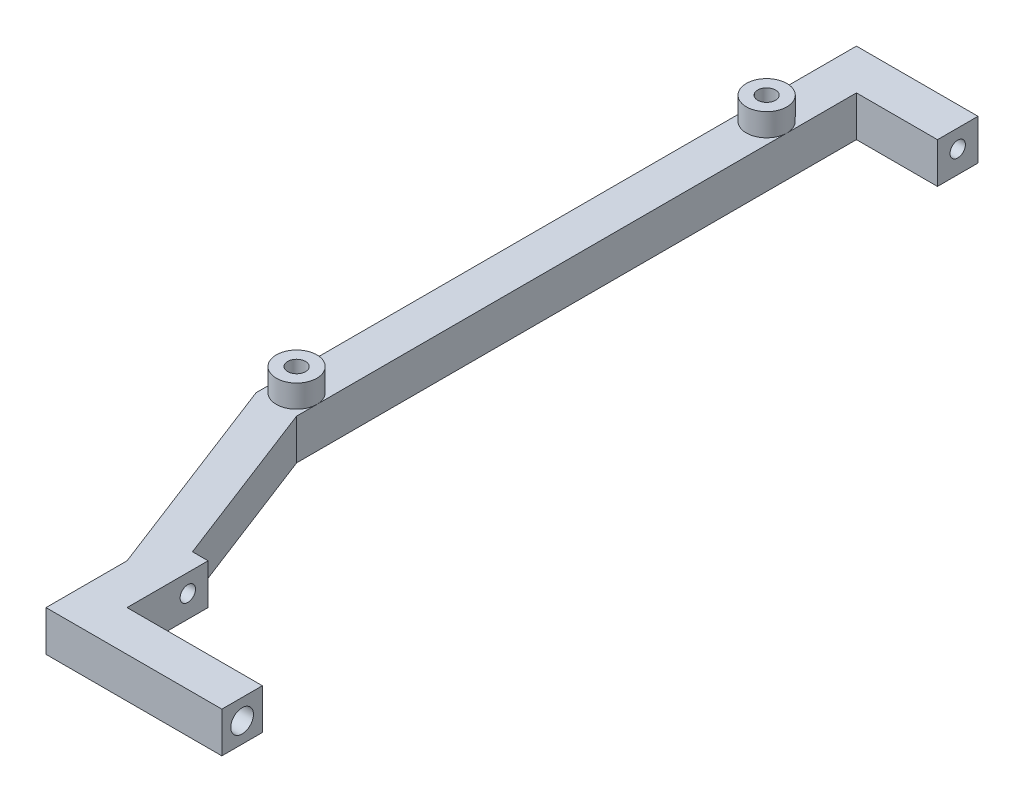
ISO-10303-21;
HEADER;
FILE_DESCRIPTION(('STEP AP214'),'2;1');
FILE_NAME('part.step','',(''),(''),'','','');
FILE_SCHEMA(('AUTOMOTIVE_DESIGN { 1 0 10303 214 1 1 1 1 }'));
ENDSEC;
DATA;
#1=APPLICATION_CONTEXT('core data for automotive mechanical design processes');
#2=APPLICATION_PROTOCOL_DEFINITION('international standard','automotive_design',2000,#1);
#3=PRODUCT_CONTEXT('',#1,'mechanical');
#4=PRODUCT('Part','Part','',(#3));
#5=PRODUCT_RELATED_PRODUCT_CATEGORY('part','',(#4));
#6=PRODUCT_DEFINITION_FORMATION('','',#4);
#7=PRODUCT_DEFINITION_CONTEXT('part definition',#1,'design');
#8=PRODUCT_DEFINITION('design','',#6,#7);
#9=PRODUCT_DEFINITION_SHAPE('','',#8);
#10=(LENGTH_UNIT() NAMED_UNIT(*) SI_UNIT(.MILLI.,.METRE.));
#11=(NAMED_UNIT(*) PLANE_ANGLE_UNIT() SI_UNIT($,.RADIAN.));
#12=(NAMED_UNIT(*) SI_UNIT($,.STERADIAN.) SOLID_ANGLE_UNIT());
#13=UNCERTAINTY_MEASURE_WITH_UNIT(LENGTH_MEASURE(1.E-05),#10,'distance_accuracy_value','');
#14=(GEOMETRIC_REPRESENTATION_CONTEXT(3) GLOBAL_UNCERTAINTY_ASSIGNED_CONTEXT((#13)) GLOBAL_UNIT_ASSIGNED_CONTEXT((#10,
#11,#12)) REPRESENTATION_CONTEXT('',''));
#15=CARTESIAN_POINT('',(0.,0.,0.));
#16=DIRECTION('',(0.,0.,1.));
#17=DIRECTION('',(1.,0.,0.));
#18=AXIS2_PLACEMENT_3D('',#15,#16,#17);
#19=CARTESIAN_POINT('',(-2.5,2.5,74.08));
#20=DIRECTION('',(0.,-1.,0.));
#21=DIRECTION('',(0.,0.,-1.));
#22=AXIS2_PLACEMENT_3D('',#19,#20,#21);
#23=PLANE('',#22);
#24=CARTESIAN_POINT('',(4.02455846426619E-13,2.5,71.58));
#25=DIRECTION('',(0.,1.,0.));
#26=DIRECTION('',(0.,0.,1.));
#27=AXIS2_PLACEMENT_3D('',#24,#25,#26);
#28=CIRCLE('',#27,2.5);
#29=CARTESIAN_POINT('',(-2.5,2.5,71.58));
#30=VERTEX_POINT('',#29);
#31=CARTESIAN_POINT('',(2.5,2.5,71.58));
#32=VERTEX_POINT('',#31);
#33=EDGE_CURVE('E264',#30,#32,#28,.T.);
#34=ORIENTED_EDGE('',*,*,#33,.F.);
#35=DIRECTION('',(0.,0.,-1.));
#36=VECTOR('',#35,1.);
#37=CARTESIAN_POINT('',(-2.5,2.5,74.08));
#38=LINE('',#37,#36);
#39=CARTESIAN_POINT('',(-2.5,2.5,74.08));
#40=VERTEX_POINT('',#39);
#41=EDGE_CURVE('E348',#40,#30,#38,.T.);
#42=ORIENTED_EDGE('',*,*,#41,.F.);
#43=DIRECTION('',(0.359943685024825,0.,0.932974031584347));
#44=VECTOR('',#43,1.);
#45=CARTESIAN_POINT('',(-2.5,2.5,74.08));
#46=LINE('',#45,#44);
#47=CARTESIAN_POINT('',(7.5,2.5,100.));
#48=VERTEX_POINT('',#47);
#49=EDGE_CURVE('E177',#40,#48,#46,.T.);
#50=ORIENTED_EDGE('',*,*,#49,.T.);
#51=DIRECTION('',(0.,0.,1.));
#52=VECTOR('',#51,1.);
#53=CARTESIAN_POINT('',(7.5,2.5,74.08));
#54=LINE('',#53,#52);
#55=CARTESIAN_POINT('',(7.5,2.5,110.));
#56=VERTEX_POINT('',#55);
#57=EDGE_CURVE('E156',#48,#56,#54,.T.);
#58=ORIENTED_EDGE('',*,*,#57,.T.);
#59=DIRECTION('',(1.,0.,0.));
#60=VECTOR('',#59,1.);
#61=CARTESIAN_POINT('',(-2.5,2.5,110.));
#62=LINE('',#61,#60);
#63=CARTESIAN_POINT('',(29.2,2.5,110.));
#64=VERTEX_POINT('',#63);
#65=EDGE_CURVE('E166',#56,#64,#62,.T.);
#66=ORIENTED_EDGE('',*,*,#65,.T.);
#67=DIRECTION('',(0.,0.,-1.));
#68=VECTOR('',#67,1.);
#69=CARTESIAN_POINT('',(29.2,2.5,74.08));
#70=LINE('',#69,#68);
#71=CARTESIAN_POINT('',(29.2,2.5,105.));
#72=VERTEX_POINT('',#71);
#73=EDGE_CURVE('E173',#64,#72,#70,.T.);
#74=ORIENTED_EDGE('',*,*,#73,.T.);
#75=DIRECTION('',(-1.,0.,0.));
#76=VECTOR('',#75,1.);
#77=CARTESIAN_POINT('',(-2.5,2.5,105.));
#78=LINE('',#77,#76);
#79=CARTESIAN_POINT('',(12.5,2.5,105.));
#80=VERTEX_POINT('',#79);
#81=EDGE_CURVE('E163',#72,#80,#78,.T.);
#82=ORIENTED_EDGE('',*,*,#81,.T.);
#83=DIRECTION('',(0.,0.,1.));
#84=VECTOR('',#83,1.);
#85=CARTESIAN_POINT('',(12.5,2.49999999999934,95.));
#86=LINE('',#85,#84);
#87=CARTESIAN_POINT('',(12.5,2.49999999999934,95.));
#88=VERTEX_POINT('',#87);
#89=EDGE_CURVE('E222',#88,#80,#86,.T.);
#90=ORIENTED_EDGE('',*,*,#89,.F.);
#91=DIRECTION('',(1.,0.,0.));
#92=VECTOR('',#91,1.);
#93=CARTESIAN_POINT('',(7.5,2.49999999999934,95.));
#94=LINE('',#93,#92);
#95=CARTESIAN_POINT('',(10.570987654321,2.49999999999934,95.));
#96=VERTEX_POINT('',#95);
#97=EDGE_CURVE('E226',#96,#88,#94,.T.);
#98=ORIENTED_EDGE('',*,*,#97,.F.);
#99=DIRECTION('',(-0.359943685024825,0.,-0.932974031584347));
#100=VECTOR('',#99,1.);
#101=CARTESIAN_POINT('',(1.85220271805375,2.5,72.4009094451953));
#102=LINE('',#101,#100);
#103=CARTESIAN_POINT('',(2.5,2.5,74.08));
#104=VERTEX_POINT('',#103);
#105=EDGE_CURVE('E229',#96,#104,#102,.T.);
#106=ORIENTED_EDGE('',*,*,#105,.T.);
#107=DIRECTION('',(0.,0.,-1.));
#108=VECTOR('',#107,1.);
#109=CARTESIAN_POINT('',(2.5,2.5,74.08));
#110=LINE('',#109,#108);
#111=EDGE_CURVE('E43',#104,#32,#110,.T.);
#112=ORIENTED_EDGE('',*,*,#111,.T.);
#113=EDGE_LOOP('',(#34,#42,#50,#58,#66,#74,#82,#90,#98,#106,#112));
#114=FACE_BOUND('',#113,.T.);
#115=ADVANCED_FACE('F39',(#114),#23,.F.);
#116=CARTESIAN_POINT('',(1.04083408558608E-13,2.5,13.58));
#117=DIRECTION('',(0.,1.,0.));
#118=DIRECTION('',(0.,0.,1.));
#119=AXIS2_PLACEMENT_3D('',#116,#117,#118);
#120=CIRCLE('',#119,2.49999999999999);
#121=CARTESIAN_POINT('',(2.50000000000009,2.5,13.58));
#122=VERTEX_POINT('',#121);
#123=CARTESIAN_POINT('',(-2.5,2.5,13.58));
#124=VERTEX_POINT('',#123);
#125=EDGE_CURVE('E50',#122,#124,#120,.T.);
#126=ORIENTED_EDGE('',*,*,#125,.F.);
#127=CARTESIAN_POINT('',(2.5,2.5,5.));
#128=VERTEX_POINT('',#127);
#129=EDGE_CURVE('E350',#122,#128,#110,.T.);
#130=ORIENTED_EDGE('',*,*,#129,.T.);
#131=DIRECTION('',(-1.,0.,0.));
#132=VECTOR('',#131,1.);
#133=CARTESIAN_POINT('',(12.5,2.5,5.));
#134=LINE('',#133,#132);
#135=CARTESIAN_POINT('',(12.5,2.5,5.));
#136=VERTEX_POINT('',#135);
#137=EDGE_CURVE('E311',#136,#128,#134,.T.);
#138=ORIENTED_EDGE('',*,*,#137,.F.);
#139=DIRECTION('',(0.,0.,1.));
#140=VECTOR('',#139,1.);
#141=CARTESIAN_POINT('',(12.5,2.5,0.));
#142=LINE('',#141,#140);
#143=CARTESIAN_POINT('',(12.5,2.5,0.));
#144=VERTEX_POINT('',#143);
#145=EDGE_CURVE('E294',#144,#136,#142,.T.);
#146=ORIENTED_EDGE('',*,*,#145,.F.);
#147=DIRECTION('',(-1.,0.,0.));
#148=VECTOR('',#147,1.);
#149=CARTESIAN_POINT('',(-2.5,2.5,0.));
#150=LINE('',#149,#148);
#151=CARTESIAN_POINT('',(-2.5,2.5,0.));
#152=VERTEX_POINT('',#151);
#153=EDGE_CURVE('E320',#144,#152,#150,.T.);
#154=ORIENTED_EDGE('',*,*,#153,.T.);
#155=EDGE_CURVE('E347',#124,#152,#38,.T.);
#156=ORIENTED_EDGE('',*,*,#155,.F.);
#157=EDGE_LOOP('',(#126,#130,#138,#146,#154,#156));
#158=FACE_BOUND('',#157,.T.);
#159=ADVANCED_FACE('F362',(#158),#23,.F.);
#160=CARTESIAN_POINT('',(2.5,2.5,74.08));
#161=DIRECTION('',(-1.,0.,0.));
#162=DIRECTION('',(0.,-1.,0.));
#163=AXIS2_PLACEMENT_3D('',#160,#161,#162);
#164=PLANE('',#163);
#165=DIRECTION('',(0.,-1.,0.));
#166=VECTOR('',#165,1.);
#167=CARTESIAN_POINT('',(2.5,2.5,5.));
#168=LINE('',#167,#166);
#169=CARTESIAN_POINT('',(2.5,-2.5,5.));
#170=VERTEX_POINT('',#169);
#171=EDGE_CURVE('E286',#128,#170,#168,.T.);
#172=ORIENTED_EDGE('',*,*,#171,.F.);
#173=ORIENTED_EDGE('',*,*,#129,.F.);
#174=EDGE_CURVE('E354',#32,#122,#110,.T.);
#175=ORIENTED_EDGE('',*,*,#174,.F.);
#176=ORIENTED_EDGE('',*,*,#111,.F.);
#177=DIRECTION('',(0.,1.,0.));
#178=VECTOR('',#177,1.);
#179=CARTESIAN_POINT('',(2.5,2.5,74.08));
#180=LINE('',#179,#178);
#181=CARTESIAN_POINT('',(2.5,-2.5,74.08));
#182=VERTEX_POINT('',#181);
#183=EDGE_CURVE('E324',#182,#104,#180,.T.);
#184=ORIENTED_EDGE('',*,*,#183,.F.);
#185=DIRECTION('',(0.,0.,-1.));
#186=VECTOR('',#185,1.);
#187=CARTESIAN_POINT('',(2.5,-2.5,74.08));
#188=LINE('',#187,#186);
#189=EDGE_CURVE('E333',#182,#170,#188,.T.);
#190=ORIENTED_EDGE('',*,*,#189,.T.);
#191=EDGE_LOOP('',(#172,#173,#175,#176,#184,#190));
#192=FACE_BOUND('',#191,.T.);
#193=ADVANCED_FACE('F41',(#192),#164,.F.);
#194=EDGE_CURVE('E57',#32,#30,#28,.T.);
#195=ORIENTED_EDGE('',*,*,#194,.F.);
#196=ORIENTED_EDGE('',*,*,#174,.T.);
#197=EDGE_CURVE('E11',#124,#122,#120,.T.);
#198=ORIENTED_EDGE('',*,*,#197,.F.);
#199=EDGE_CURVE('E64',#30,#124,#38,.T.);
#200=ORIENTED_EDGE('',*,*,#199,.F.);
#201=EDGE_LOOP('',(#195,#196,#198,#200));
#202=FACE_BOUND('',#201,.T.);
#203=ADVANCED_FACE('F425',(#202),#23,.F.);
#204=CARTESIAN_POINT('',(-2.5,2.5,74.08));
#205=DIRECTION('',(1.,0.,0.));
#206=DIRECTION('',(0.,1.,0.));
#207=AXIS2_PLACEMENT_3D('',#204,#205,#206);
#208=PLANE('',#207);
#209=DIRECTION('',(0.,-1.,0.));
#210=VECTOR('',#209,1.);
#211=CARTESIAN_POINT('',(-2.5,2.5,0.));
#212=LINE('',#211,#210);
#213=CARTESIAN_POINT('',(-2.5,-2.5,0.));
#214=VERTEX_POINT('',#213);
#215=EDGE_CURVE('E337',#152,#214,#212,.T.);
#216=ORIENTED_EDGE('',*,*,#215,.T.);
#217=DIRECTION('',(0.,0.,-1.));
#218=VECTOR('',#217,1.);
#219=CARTESIAN_POINT('',(-2.5,-2.5,74.08));
#220=LINE('',#219,#218);
#221=CARTESIAN_POINT('',(-2.5,-2.5,74.08));
#222=VERTEX_POINT('',#221);
#223=EDGE_CURVE('E344',#222,#214,#220,.T.);
#224=ORIENTED_EDGE('',*,*,#223,.F.);
#225=DIRECTION('',(0.,-1.,0.));
#226=VECTOR('',#225,1.);
#227=CARTESIAN_POINT('',(-2.5,2.5,74.08));
#228=LINE('',#227,#226);
#229=EDGE_CURVE('E328',#40,#222,#228,.T.);
#230=ORIENTED_EDGE('',*,*,#229,.F.);
#231=ORIENTED_EDGE('',*,*,#41,.T.);
#232=ORIENTED_EDGE('',*,*,#199,.T.);
#233=ORIENTED_EDGE('',*,*,#155,.T.);
#234=EDGE_LOOP('',(#216,#224,#230,#231,#232,#233));
#235=FACE_BOUND('',#234,.T.);
#236=ADVANCED_FACE('F357',(#235),#208,.F.);
#237=CARTESIAN_POINT('',(-2.5,-2.5,74.08));
#238=DIRECTION('',(0.,1.,0.));
#239=DIRECTION('',(0.,0.,1.));
#240=AXIS2_PLACEMENT_3D('',#237,#238,#239);
#241=PLANE('',#240);
#242=DIRECTION('',(1.,0.,0.));
#243=VECTOR('',#242,1.);
#244=CARTESIAN_POINT('',(-2.5,-2.5,0.));
#245=LINE('',#244,#243);
#246=CARTESIAN_POINT('',(12.5,-2.5,0.));
#247=VERTEX_POINT('',#246);
#248=EDGE_CURVE('E329',#214,#247,#245,.T.);
#249=ORIENTED_EDGE('',*,*,#248,.T.);
#250=DIRECTION('',(0.,0.,-1.));
#251=VECTOR('',#250,1.);
#252=CARTESIAN_POINT('',(12.5,-2.5,0.));
#253=LINE('',#252,#251);
#254=CARTESIAN_POINT('',(12.5,-2.5,5.));
#255=VERTEX_POINT('',#254);
#256=EDGE_CURVE('E300',#255,#247,#253,.T.);
#257=ORIENTED_EDGE('',*,*,#256,.F.);
#258=DIRECTION('',(-1.,0.,0.));
#259=VECTOR('',#258,1.);
#260=CARTESIAN_POINT('',(12.5,-2.5,5.));
#261=LINE('',#260,#259);
#262=EDGE_CURVE('E304',#255,#170,#261,.T.);
#263=ORIENTED_EDGE('',*,*,#262,.T.);
#264=ORIENTED_EDGE('',*,*,#189,.F.);
#265=DIRECTION('',(-0.359943685024825,0.,-0.932974031584347));
#266=VECTOR('',#265,1.);
#267=CARTESIAN_POINT('',(1.85220271805375,-2.50000000000066,72.4009094451953));
#268=LINE('',#267,#266);
#269=CARTESIAN_POINT('',(10.570987654321,-2.50000000000066,95.));
#270=VERTEX_POINT('',#269);
#271=EDGE_CURVE('E238',#270,#182,#268,.T.);
#272=ORIENTED_EDGE('',*,*,#271,.F.);
#273=DIRECTION('',(1.,0.,0.));
#274=VECTOR('',#273,1.);
#275=CARTESIAN_POINT('',(7.5,-2.50000000000066,95.));
#276=LINE('',#275,#274);
#277=CARTESIAN_POINT('',(12.5,-2.50000000000066,95.));
#278=VERTEX_POINT('',#277);
#279=EDGE_CURVE('E225',#270,#278,#276,.T.);
#280=ORIENTED_EDGE('',*,*,#279,.T.);
#281=DIRECTION('',(0.,0.,-1.));
#282=VECTOR('',#281,1.);
#283=CARTESIAN_POINT('',(12.5,-2.50000000000066,100.));
#284=LINE('',#283,#282);
#285=CARTESIAN_POINT('',(12.5,-2.5,105.));
#286=VERTEX_POINT('',#285);
#287=EDGE_CURVE('E211',#286,#278,#284,.T.);
#288=ORIENTED_EDGE('',*,*,#287,.F.);
#289=DIRECTION('',(1.,0.,0.));
#290=VECTOR('',#289,1.);
#291=CARTESIAN_POINT('',(-2.5,-2.5,105.));
#292=LINE('',#291,#290);
#293=CARTESIAN_POINT('',(29.2,-2.5,105.));
#294=VERTEX_POINT('',#293);
#295=EDGE_CURVE('E186',#286,#294,#292,.T.);
#296=ORIENTED_EDGE('',*,*,#295,.T.);
#297=DIRECTION('',(0.,0.,1.));
#298=VECTOR('',#297,1.);
#299=CARTESIAN_POINT('',(29.2,-2.5,74.08));
#300=LINE('',#299,#298);
#301=CARTESIAN_POINT('',(29.2,-2.5,110.));
#302=VERTEX_POINT('',#301);
#303=EDGE_CURVE('E399',#294,#302,#300,.T.);
#304=ORIENTED_EDGE('',*,*,#303,.T.);
#305=DIRECTION('',(-1.,0.,0.));
#306=VECTOR('',#305,1.);
#307=CARTESIAN_POINT('',(-2.5,-2.5,110.));
#308=LINE('',#307,#306);
#309=CARTESIAN_POINT('',(7.5,-2.5,110.));
#310=VERTEX_POINT('',#309);
#311=EDGE_CURVE('E198',#302,#310,#308,.T.);
#312=ORIENTED_EDGE('',*,*,#311,.T.);
#313=DIRECTION('',(0.,0.,-1.));
#314=VECTOR('',#313,1.);
#315=CARTESIAN_POINT('',(7.5,-2.5,74.08));
#316=LINE('',#315,#314);
#317=CARTESIAN_POINT('',(7.5,-2.50000000000066,100.));
#318=VERTEX_POINT('',#317);
#319=EDGE_CURVE('E158',#310,#318,#316,.T.);
#320=ORIENTED_EDGE('',*,*,#319,.T.);
#321=DIRECTION('',(0.359943685024825,0.,0.932974031584347));
#322=VECTOR('',#321,1.);
#323=CARTESIAN_POINT('',(-2.5,-2.50000000000066,74.08));
#324=LINE('',#323,#322);
#325=EDGE_CURVE('E234',#222,#318,#324,.T.);
#326=ORIENTED_EDGE('',*,*,#325,.F.);
#327=ORIENTED_EDGE('',*,*,#223,.T.);
#328=EDGE_LOOP('',(#249,#257,#263,#264,#272,#280,#288,#296,#304,#312,#320,#326,#327));
#329=FACE_BOUND('',#328,.T.);
#330=ADVANCED_FACE('F370',(#329),#241,.F.);
#331=CARTESIAN_POINT('',(0.,0.,0.));
#332=DIRECTION('',(0.,0.,1.));
#333=DIRECTION('',(1.,0.,0.));
#334=AXIS2_PLACEMENT_3D('',#331,#332,#333);
#335=PLANE('',#334);
#336=CARTESIAN_POINT('',(0.,0.,0.));
#337=DIRECTION('',(0.,0.,-1.));
#338=DIRECTION('',(-1.,0.,0.));
#339=AXIS2_PLACEMENT_3D('',#336,#337,#338);
#340=CIRCLE('',#339,1.4);
#341=CARTESIAN_POINT('',(-1.4,0.,0.));
#342=VERTEX_POINT('',#341);
#343=EDGE_CURVE('E315',#342,#342,#340,.T.);
#344=ORIENTED_EDGE('',*,*,#343,.F.);
#345=EDGE_LOOP('',(#344));
#346=FACE_BOUND('',#345,.T.);
#347=ORIENTED_EDGE('',*,*,#153,.F.);
#348=DIRECTION('',(0.,1.,0.));
#349=VECTOR('',#348,1.);
#350=CARTESIAN_POINT('',(12.5,2.5,0.));
#351=LINE('',#350,#349);
#352=EDGE_CURVE('E290',#247,#144,#351,.T.);
#353=ORIENTED_EDGE('',*,*,#352,.F.);
#354=ORIENTED_EDGE('',*,*,#248,.F.);
#355=ORIENTED_EDGE('',*,*,#215,.F.);
#356=EDGE_LOOP('',(#347,#353,#354,#355));
#357=FACE_BOUND('',#356,.T.);
#358=ADVANCED_FACE('F367',(#346,#357),#335,.F.);
#359=CARTESIAN_POINT('',(0.,0.,10.));
#360=DIRECTION('',(0.,0.,-1.));
#361=DIRECTION('',(-1.,0.,0.));
#362=AXIS2_PLACEMENT_3D('',#359,#360,#361);
#363=CYLINDRICAL_SURFACE('',#362,1.4);
#364=CARTESIAN_POINT('',(0.,0.,10.));
#365=DIRECTION('',(0.,0.,-1.));
#366=DIRECTION('',(-1.,0.,0.));
#367=AXIS2_PLACEMENT_3D('',#364,#365,#366);
#368=CIRCLE('',#367,1.4);
#369=CARTESIAN_POINT('',(-1.4,0.,10.));
#370=VERTEX_POINT('',#369);
#371=EDGE_CURVE('E316',#370,#370,#368,.T.);
#372=ORIENTED_EDGE('',*,*,#371,.F.);
#373=EDGE_LOOP('',(#372));
#374=FACE_BOUND('',#373,.T.);
#375=ORIENTED_EDGE('',*,*,#343,.T.);
#376=EDGE_LOOP('',(#375));
#377=FACE_BOUND('',#376,.T.);
#378=ADVANCED_FACE('F487',(#374,#377),#363,.F.);
#379=CARTESIAN_POINT('',(0.,0.,10.));
#380=DIRECTION('',(0.,0.,-1.));
#381=DIRECTION('',(-1.,0.,0.));
#382=AXIS2_PLACEMENT_3D('',#379,#380,#381);
#383=PLANE('',#382);
#384=ORIENTED_EDGE('',*,*,#371,.T.);
#385=EDGE_LOOP('',(#384));
#386=FACE_BOUND('',#385,.T.);
#387=ADVANCED_FACE('F484',(#386),#383,.T.);
#388=CARTESIAN_POINT('',(12.5,2.5,5.));
#389=DIRECTION('',(0.,0.,-1.));
#390=DIRECTION('',(0.,1.,0.));
#391=AXIS2_PLACEMENT_3D('',#388,#389,#390);
#392=PLANE('',#391);
#393=ORIENTED_EDGE('',*,*,#171,.T.);
#394=ORIENTED_EDGE('',*,*,#262,.F.);
#395=DIRECTION('',(0.,-1.,0.));
#396=VECTOR('',#395,1.);
#397=CARTESIAN_POINT('',(12.5,2.5,5.));
#398=LINE('',#397,#396);
#399=EDGE_CURVE('E297',#136,#255,#398,.T.);
#400=ORIENTED_EDGE('',*,*,#399,.F.);
#401=ORIENTED_EDGE('',*,*,#137,.T.);
#402=EDGE_LOOP('',(#393,#394,#400,#401));
#403=FACE_BOUND('',#402,.T.);
#404=ADVANCED_FACE('F377',(#403),#392,.F.);
#405=CARTESIAN_POINT('',(12.5,0.,0.));
#406=DIRECTION('',(-1.,0.,0.));
#407=DIRECTION('',(0.,-1.,0.));
#408=AXIS2_PLACEMENT_3D('',#405,#406,#407);
#409=PLANE('',#408);
#410=CARTESIAN_POINT('',(12.5,0.250000000000002,2.5));
#411=DIRECTION('',(1.,0.,0.));
#412=DIRECTION('',(0.,1.,0.));
#413=AXIS2_PLACEMENT_3D('',#410,#411,#412);
#414=CIRCLE('',#413,0.95);
#415=CARTESIAN_POINT('',(12.5,1.2,2.5));
#416=VERTEX_POINT('',#415);
#417=EDGE_CURVE('E278',#416,#416,#414,.T.);
#418=ORIENTED_EDGE('',*,*,#417,.F.);
#419=EDGE_LOOP('',(#418));
#420=FACE_BOUND('',#419,.T.);
#421=ORIENTED_EDGE('',*,*,#352,.T.);
#422=ORIENTED_EDGE('',*,*,#145,.T.);
#423=ORIENTED_EDGE('',*,*,#399,.T.);
#424=ORIENTED_EDGE('',*,*,#256,.T.);
#425=EDGE_LOOP('',(#421,#422,#423,#424));
#426=FACE_BOUND('',#425,.T.);
#427=ADVANCED_FACE('F373',(#420,#426),#409,.F.);
#428=CARTESIAN_POINT('',(7.5,0.250000000000001,2.5));
#429=DIRECTION('',(1.,0.,0.));
#430=DIRECTION('',(0.,1.,0.));
#431=AXIS2_PLACEMENT_3D('',#428,#429,#430);
#432=CYLINDRICAL_SURFACE('',#431,0.95);
#433=CARTESIAN_POINT('',(7.5,0.250000000000001,2.5));
#434=DIRECTION('',(1.,0.,0.));
#435=DIRECTION('',(0.,1.,0.));
#436=AXIS2_PLACEMENT_3D('',#433,#434,#435);
#437=CIRCLE('',#436,0.95);
#438=CARTESIAN_POINT('',(7.5,1.2,2.5));
#439=VERTEX_POINT('',#438);
#440=EDGE_CURVE('E282',#439,#439,#437,.T.);
#441=ORIENTED_EDGE('',*,*,#440,.F.);
#442=EDGE_LOOP('',(#441));
#443=FACE_BOUND('',#442,.T.);
#444=ORIENTED_EDGE('',*,*,#417,.T.);
#445=EDGE_LOOP('',(#444));
#446=FACE_BOUND('',#445,.T.);
#447=ADVANCED_FACE('F474',(#443,#446),#432,.F.);
#448=CARTESIAN_POINT('',(7.5,0.250000000000001,2.5));
#449=DIRECTION('',(1.,0.,0.));
#450=DIRECTION('',(0.,1.,0.));
#451=AXIS2_PLACEMENT_3D('',#448,#449,#450);
#452=PLANE('',#451);
#453=ORIENTED_EDGE('',*,*,#440,.T.);
#454=EDGE_LOOP('',(#453));
#455=FACE_BOUND('',#454,.T.);
#456=ADVANCED_FACE('F469',(#455),#452,.T.);
#457=CARTESIAN_POINT('',(1.04083408558608E-13,5.3,13.58));
#458=DIRECTION('',(0.,1.,0.));
#459=DIRECTION('',(0.,0.,1.));
#460=AXIS2_PLACEMENT_3D('',#457,#458,#459);
#461=PLANE('',#460);
#462=CARTESIAN_POINT('',(1.04083408558608E-13,5.3,13.58));
#463=DIRECTION('',(0.,1.,0.));
#464=DIRECTION('',(0.,0.,1.));
#465=AXIS2_PLACEMENT_3D('',#462,#463,#464);
#466=CIRCLE('',#465,2.49999999999999);
#467=CARTESIAN_POINT('',(1.04083408558608E-13,5.3,16.08));
#468=VERTEX_POINT('',#467);
#469=EDGE_CURVE('E275',#468,#468,#466,.T.);
#470=ORIENTED_EDGE('',*,*,#469,.T.);
#471=EDGE_LOOP('',(#470));
#472=FACE_BOUND('',#471,.T.);
#473=CARTESIAN_POINT('',(1.04083408558608E-13,5.3,13.58));
#474=DIRECTION('',(0.,1.,0.));
#475=DIRECTION('',(0.,0.,1.));
#476=AXIS2_PLACEMENT_3D('',#473,#474,#475);
#477=CIRCLE('',#476,1.09999999999999);
#478=CARTESIAN_POINT('',(1.04083408558608E-13,5.3,14.68));
#479=VERTEX_POINT('',#478);
#480=EDGE_CURVE('E268',#479,#479,#477,.T.);
#481=ORIENTED_EDGE('',*,*,#480,.F.);
#482=EDGE_LOOP('',(#481));
#483=FACE_BOUND('',#482,.T.);
#484=ADVANCED_FACE('F463',(#472,#483),#461,.T.);
#485=CARTESIAN_POINT('',(1.04083408558608E-13,5.3,13.58));
#486=DIRECTION('',(0.,-1.,0.));
#487=DIRECTION('',(0.,0.,-1.));
#488=AXIS2_PLACEMENT_3D('',#485,#486,#487);
#489=CYLINDRICAL_SURFACE('',#488,2.49999999999999);
#490=ORIENTED_EDGE('',*,*,#469,.F.);
#491=EDGE_LOOP('',(#490));
#492=FACE_BOUND('',#491,.T.);
#493=ORIENTED_EDGE('',*,*,#125,.T.);
#494=ORIENTED_EDGE('',*,*,#197,.T.);
#495=EDGE_LOOP('',(#493,#494));
#496=FACE_BOUND('',#495,.T.);
#497=ADVANCED_FACE('F456',(#492,#496),#489,.T.);
#498=CARTESIAN_POINT('',(1.04083408558608E-13,5.3,13.58));
#499=DIRECTION('',(0.,-1.,0.));
#500=DIRECTION('',(0.,0.,-1.));
#501=AXIS2_PLACEMENT_3D('',#498,#499,#500);
#502=CYLINDRICAL_SURFACE('',#501,1.09999999999999);
#503=ORIENTED_EDGE('',*,*,#480,.T.);
#504=EDGE_LOOP('',(#503));
#505=FACE_BOUND('',#504,.T.);
#506=CARTESIAN_POINT('',(1.04083408558608E-13,2.5,13.58));
#507=DIRECTION('',(0.,1.,0.));
#508=DIRECTION('',(0.,0.,1.));
#509=AXIS2_PLACEMENT_3D('',#506,#507,#508);
#510=CIRCLE('',#509,1.09999999999999);
#511=CARTESIAN_POINT('',(1.04083408558608E-13,2.5,14.68));
#512=VERTEX_POINT('',#511);
#513=EDGE_CURVE('E263',#512,#512,#510,.T.);
#514=ORIENTED_EDGE('',*,*,#513,.F.);
#515=EDGE_LOOP('',(#514));
#516=FACE_BOUND('',#515,.T.);
#517=ADVANCED_FACE('F445',(#505,#516),#502,.F.);
#518=ORIENTED_EDGE('',*,*,#513,.T.);
#519=EDGE_LOOP('',(#518));
#520=FACE_BOUND('',#519,.T.);
#521=ADVANCED_FACE('F431',(#520),#23,.F.);
#522=CARTESIAN_POINT('',(4.02455846426619E-13,5.3,71.58));
#523=DIRECTION('',(0.,1.,0.));
#524=DIRECTION('',(0.,0.,1.));
#525=AXIS2_PLACEMENT_3D('',#522,#523,#524);
#526=PLANE('',#525);
#527=CARTESIAN_POINT('',(4.02455846426619E-13,5.3,71.58));
#528=DIRECTION('',(0.,1.,0.));
#529=DIRECTION('',(0.,0.,1.));
#530=AXIS2_PLACEMENT_3D('',#527,#528,#529);
#531=CIRCLE('',#530,2.5);
#532=CARTESIAN_POINT('',(4.02455846426619E-13,5.3,74.08));
#533=VERTEX_POINT('',#532);
#534=EDGE_CURVE('E259',#533,#533,#531,.T.);
#535=ORIENTED_EDGE('',*,*,#534,.T.);
#536=EDGE_LOOP('',(#535));
#537=FACE_BOUND('',#536,.T.);
#538=CARTESIAN_POINT('',(4.02455846426619E-13,5.3,71.58));
#539=DIRECTION('',(0.,1.,0.));
#540=DIRECTION('',(0.,0.,1.));
#541=AXIS2_PLACEMENT_3D('',#538,#539,#540);
#542=CIRCLE('',#541,1.1);
#543=CARTESIAN_POINT('',(4.02455846426619E-13,5.3,72.68));
#544=VERTEX_POINT('',#543);
#545=EDGE_CURVE('E252',#544,#544,#542,.T.);
#546=ORIENTED_EDGE('',*,*,#545,.F.);
#547=EDGE_LOOP('',(#546));
#548=FACE_BOUND('',#547,.T.);
#549=ADVANCED_FACE('F444',(#537,#548),#526,.T.);
#550=CARTESIAN_POINT('',(4.02455846426619E-13,5.3,71.58));
#551=DIRECTION('',(0.,-1.,0.));
#552=DIRECTION('',(0.,0.,-1.));
#553=AXIS2_PLACEMENT_3D('',#550,#551,#552);
#554=CYLINDRICAL_SURFACE('',#553,2.5);
#555=ORIENTED_EDGE('',*,*,#534,.F.);
#556=EDGE_LOOP('',(#555));
#557=FACE_BOUND('',#556,.T.);
#558=ORIENTED_EDGE('',*,*,#33,.T.);
#559=ORIENTED_EDGE('',*,*,#194,.T.);
#560=EDGE_LOOP('',(#558,#559));
#561=FACE_BOUND('',#560,.T.);
#562=ADVANCED_FACE('F452',(#557,#561),#554,.T.);
#563=CARTESIAN_POINT('',(4.02455846426619E-13,5.3,71.58));
#564=DIRECTION('',(0.,-1.,0.));
#565=DIRECTION('',(0.,0.,-1.));
#566=AXIS2_PLACEMENT_3D('',#563,#564,#565);
#567=CYLINDRICAL_SURFACE('',#566,1.1);
#568=ORIENTED_EDGE('',*,*,#545,.T.);
#569=EDGE_LOOP('',(#568));
#570=FACE_BOUND('',#569,.T.);
#571=CARTESIAN_POINT('',(4.02455846426619E-13,2.5,71.58));
#572=DIRECTION('',(0.,1.,0.));
#573=DIRECTION('',(0.,0.,1.));
#574=AXIS2_PLACEMENT_3D('',#571,#572,#573);
#575=CIRCLE('',#574,1.1);
#576=CARTESIAN_POINT('',(4.02455846426619E-13,2.5,72.68));
#577=VERTEX_POINT('',#576);
#578=EDGE_CURVE('E242',#577,#577,#575,.T.);
#579=ORIENTED_EDGE('',*,*,#578,.F.);
#580=EDGE_LOOP('',(#579));
#581=FACE_BOUND('',#580,.T.);
#582=ADVANCED_FACE('F435',(#570,#581),#567,.F.);
#583=ORIENTED_EDGE('',*,*,#578,.T.);
#584=EDGE_LOOP('',(#583));
#585=FACE_BOUND('',#584,.T.);
#586=ADVANCED_FACE('F424',(#585),#23,.F.);
#587=CARTESIAN_POINT('',(-2.49999999999999,-31.5292459126904,74.08));
#588=DIRECTION('',(-0.932974031584347,0.,0.359943685024825));
#589=DIRECTION('',(0.359943685024825,0.,0.932974031584347));
#590=AXIS2_PLACEMENT_3D('',#587,#588,#589);
#591=PLANE('',#590);
#592=ORIENTED_EDGE('',*,*,#229,.T.);
#593=ORIENTED_EDGE('',*,*,#325,.T.);
#594=DIRECTION('',(0.,1.,0.));
#595=VECTOR('',#594,1.);
#596=CARTESIAN_POINT('',(7.50000000000001,-31.5292459126904,100.));
#597=LINE('',#596,#595);
#598=EDGE_CURVE('E246',#318,#48,#597,.T.);
#599=ORIENTED_EDGE('',*,*,#598,.T.);
#600=ORIENTED_EDGE('',*,*,#49,.F.);
#601=EDGE_LOOP('',(#592,#593,#599,#600));
#602=FACE_BOUND('',#601,.T.);
#603=ADVANCED_FACE('F434',(#602),#591,.T.);
#604=CARTESIAN_POINT('',(1.85220271805375,-31.5292459126904,72.4009094451953));
#605=DIRECTION('',(0.932974031584347,0.,-0.359943685024825));
#606=DIRECTION('',(-0.359943685024825,0.,-0.932974031584347));
#607=AXIS2_PLACEMENT_3D('',#604,#605,#606);
#608=PLANE('',#607);
#609=DIRECTION('',(0.,1.,0.));
#610=VECTOR('',#609,1.);
#611=CARTESIAN_POINT('',(10.570987654321,-31.5292459126904,95.));
#612=LINE('',#611,#610);
#613=EDGE_CURVE('E243',#270,#96,#612,.T.);
#614=ORIENTED_EDGE('',*,*,#613,.F.);
#615=ORIENTED_EDGE('',*,*,#271,.T.);
#616=ORIENTED_EDGE('',*,*,#183,.T.);
#617=ORIENTED_EDGE('',*,*,#105,.F.);
#618=EDGE_LOOP('',(#614,#615,#616,#617));
#619=FACE_BOUND('',#618,.T.);
#620=ADVANCED_FACE('F384',(#619),#608,.T.);
#621=CARTESIAN_POINT('',(7.5,-2.50000000000066,95.));
#622=DIRECTION('',(0.,0.,-1.));
#623=DIRECTION('',(-1.,0.,0.));
#624=AXIS2_PLACEMENT_3D('',#621,#622,#623);
#625=PLANE('',#624);
#626=ORIENTED_EDGE('',*,*,#279,.F.);
#627=ORIENTED_EDGE('',*,*,#613,.T.);
#628=ORIENTED_EDGE('',*,*,#97,.T.);
#629=DIRECTION('',(0.,1.,0.));
#630=VECTOR('',#629,1.);
#631=CARTESIAN_POINT('',(12.5,-2.50000000000066,95.));
#632=LINE('',#631,#630);
#633=EDGE_CURVE('E218',#278,#88,#632,.T.);
#634=ORIENTED_EDGE('',*,*,#633,.F.);
#635=EDGE_LOOP('',(#626,#627,#628,#634));
#636=FACE_BOUND('',#635,.T.);
#637=ADVANCED_FACE('F389',(#636),#625,.T.);
#638=CARTESIAN_POINT('',(12.5,0.,0.));
#639=DIRECTION('',(1.,0.,0.));
#640=DIRECTION('',(0.,0.,-1.));
#641=AXIS2_PLACEMENT_3D('',#638,#639,#640);
#642=PLANE('',#641);
#643=CARTESIAN_POINT('',(12.5,0.249999999999339,97.5));
#644=DIRECTION('',(1.,0.,0.));
#645=DIRECTION('',(0.,1.,0.));
#646=AXIS2_PLACEMENT_3D('',#643,#644,#645);
#647=CIRCLE('',#646,0.950000000000001);
#648=CARTESIAN_POINT('',(12.5,1.19999999999934,97.5));
#649=VERTEX_POINT('',#648);
#650=EDGE_CURVE('E206',#649,#649,#647,.T.);
#651=ORIENTED_EDGE('',*,*,#650,.F.);
#652=EDGE_LOOP('',(#651));
#653=FACE_BOUND('',#652,.T.);
#654=ORIENTED_EDGE('',*,*,#287,.T.);
#655=ORIENTED_EDGE('',*,*,#633,.T.);
#656=ORIENTED_EDGE('',*,*,#89,.T.);
#657=DIRECTION('',(0.,1.,0.));
#658=VECTOR('',#657,1.);
#659=CARTESIAN_POINT('',(12.5,-26.3933045014707,105.));
#660=LINE('',#659,#658);
#661=EDGE_CURVE('E194',#286,#80,#660,.T.);
#662=ORIENTED_EDGE('',*,*,#661,.F.);
#663=EDGE_LOOP('',(#654,#655,#656,#662));
#664=FACE_BOUND('',#663,.T.);
#665=ADVANCED_FACE('F400',(#653,#664),#642,.T.);
#666=CARTESIAN_POINT('',(7.5,0.249999999999338,97.5));
#667=DIRECTION('',(1.,0.,0.));
#668=DIRECTION('',(0.,1.,0.));
#669=AXIS2_PLACEMENT_3D('',#666,#667,#668);
#670=CYLINDRICAL_SURFACE('',#669,0.950000000000001);
#671=CARTESIAN_POINT('',(7.5,0.249999999999338,97.5));
#672=DIRECTION('',(1.,0.,0.));
#673=DIRECTION('',(0.,1.,0.));
#674=AXIS2_PLACEMENT_3D('',#671,#672,#673);
#675=CIRCLE('',#674,0.950000000000001);
#676=CARTESIAN_POINT('',(7.5,1.19999999999934,97.5));
#677=VERTEX_POINT('',#676);
#678=EDGE_CURVE('E207',#677,#677,#675,.T.);
#679=ORIENTED_EDGE('',*,*,#678,.F.);
#680=EDGE_LOOP('',(#679));
#681=FACE_BOUND('',#680,.T.);
#682=ORIENTED_EDGE('',*,*,#650,.T.);
#683=EDGE_LOOP('',(#682));
#684=FACE_BOUND('',#683,.T.);
#685=ADVANCED_FACE('F518',(#681,#684),#670,.F.);
#686=CARTESIAN_POINT('',(7.50000000000001,-31.5292459126904,74.08));
#687=DIRECTION('',(1.,0.,0.));
#688=DIRECTION('',(0.,1.,0.));
#689=AXIS2_PLACEMENT_3D('',#686,#687,#688);
#690=PLANE('',#689);
#691=ORIENTED_EDGE('',*,*,#678,.T.);
#692=EDGE_LOOP('',(#691));
#693=FACE_BOUND('',#692,.T.);
#694=ADVANCED_FACE('F421',(#693),#690,.T.);
#695=CARTESIAN_POINT('',(-2.5,-26.3933045014707,105.));
#696=DIRECTION('',(0.,0.,-1.));
#697=DIRECTION('',(-1.,0.,0.));
#698=AXIS2_PLACEMENT_3D('',#695,#696,#697);
#699=PLANE('',#698);
#700=ORIENTED_EDGE('',*,*,#295,.F.);
#701=ORIENTED_EDGE('',*,*,#661,.T.);
#702=ORIENTED_EDGE('',*,*,#81,.F.);
#703=DIRECTION('',(0.,1.,0.));
#704=VECTOR('',#703,1.);
#705=CARTESIAN_POINT('',(29.2,-26.3933045014707,105.));
#706=LINE('',#705,#704);
#707=EDGE_CURVE('E199',#294,#72,#706,.T.);
#708=ORIENTED_EDGE('',*,*,#707,.F.);
#709=EDGE_LOOP('',(#700,#701,#702,#708));
#710=FACE_BOUND('',#709,.T.);
#711=ADVANCED_FACE('F396',(#710),#699,.T.);
#712=CARTESIAN_POINT('',(29.2,-26.3933045014707,74.08));
#713=DIRECTION('',(1.,0.,0.));
#714=DIRECTION('',(0.,0.,-1.));
#715=AXIS2_PLACEMENT_3D('',#712,#713,#714);
#716=PLANE('',#715);
#717=CARTESIAN_POINT('',(29.2,0.,107.5));
#718=DIRECTION('',(1.,0.,0.));
#719=DIRECTION('',(0.,0.,-1.));
#720=AXIS2_PLACEMENT_3D('',#717,#718,#719);
#721=CIRCLE('',#720,1.4);
#722=CARTESIAN_POINT('',(29.2,0.,106.1));
#723=VERTEX_POINT('',#722);
#724=EDGE_CURVE('E183',#723,#723,#721,.T.);
#725=ORIENTED_EDGE('',*,*,#724,.F.);
#726=EDGE_LOOP('',(#725));
#727=FACE_BOUND('',#726,.T.);
#728=ORIENTED_EDGE('',*,*,#303,.F.);
#729=ORIENTED_EDGE('',*,*,#707,.T.);
#730=ORIENTED_EDGE('',*,*,#73,.F.);
#731=DIRECTION('',(0.,1.,0.));
#732=VECTOR('',#731,1.);
#733=CARTESIAN_POINT('',(29.2,-26.3933045014707,110.));
#734=LINE('',#733,#732);
#735=EDGE_CURVE('E162',#302,#64,#734,.T.);
#736=ORIENTED_EDGE('',*,*,#735,.F.);
#737=EDGE_LOOP('',(#728,#729,#730,#736));
#738=FACE_BOUND('',#737,.T.);
#739=ADVANCED_FACE('F403',(#727,#738),#716,.T.);
#740=CARTESIAN_POINT('',(-2.5,-26.3933045014707,110.));
#741=DIRECTION('',(0.,0.,1.));
#742=DIRECTION('',(1.,0.,0.));
#743=AXIS2_PLACEMENT_3D('',#740,#741,#742);
#744=PLANE('',#743);
#745=ORIENTED_EDGE('',*,*,#311,.F.);
#746=ORIENTED_EDGE('',*,*,#735,.T.);
#747=ORIENTED_EDGE('',*,*,#65,.F.);
#748=DIRECTION('',(0.,1.,0.));
#749=VECTOR('',#748,1.);
#750=CARTESIAN_POINT('',(7.5,-26.3933045014707,110.));
#751=LINE('',#750,#749);
#752=EDGE_CURVE('E151',#310,#56,#751,.T.);
#753=ORIENTED_EDGE('',*,*,#752,.F.);
#754=EDGE_LOOP('',(#745,#746,#747,#753));
#755=FACE_BOUND('',#754,.T.);
#756=ADVANCED_FACE('F167',(#755),#744,.T.);
#757=CARTESIAN_POINT('',(7.5,-26.3933045014707,74.08));
#758=DIRECTION('',(-1.,0.,0.));
#759=DIRECTION('',(0.,0.,1.));
#760=AXIS2_PLACEMENT_3D('',#757,#758,#759);
#761=PLANE('',#760);
#762=ORIENTED_EDGE('',*,*,#319,.F.);
#763=ORIENTED_EDGE('',*,*,#752,.T.);
#764=ORIENTED_EDGE('',*,*,#57,.F.);
#765=ORIENTED_EDGE('',*,*,#598,.F.);
#766=EDGE_LOOP('',(#762,#763,#764,#765));
#767=FACE_BOUND('',#766,.T.);
#768=ADVANCED_FACE('F153',(#767),#761,.T.);
#769=CARTESIAN_POINT('',(19.2,0.,107.5));
#770=DIRECTION('',(1.,0.,0.));
#771=DIRECTION('',(0.,0.,-1.));
#772=AXIS2_PLACEMENT_3D('',#769,#770,#771);
#773=CYLINDRICAL_SURFACE('',#772,1.4);
#774=CARTESIAN_POINT('',(19.2,0.,107.5));
#775=DIRECTION('',(1.,0.,0.));
#776=DIRECTION('',(0.,0.,-1.));
#777=AXIS2_PLACEMENT_3D('',#774,#775,#776);
#778=CIRCLE('',#777,1.4);
#779=CARTESIAN_POINT('',(19.2,0.,106.1));
#780=VERTEX_POINT('',#779);
#781=EDGE_CURVE('E179',#780,#780,#778,.T.);
#782=ORIENTED_EDGE('',*,*,#781,.F.);
#783=EDGE_LOOP('',(#782));
#784=FACE_BOUND('',#783,.T.);
#785=ORIENTED_EDGE('',*,*,#724,.T.);
#786=EDGE_LOOP('',(#785));
#787=FACE_BOUND('',#786,.T.);
#788=ADVANCED_FACE('F412',(#784,#787),#773,.F.);
#789=CARTESIAN_POINT('',(19.2,0.,107.5));
#790=DIRECTION('',(1.,0.,0.));
#791=DIRECTION('',(0.,0.,-1.));
#792=AXIS2_PLACEMENT_3D('',#789,#790,#791);
#793=PLANE('',#792);
#794=ORIENTED_EDGE('',*,*,#781,.T.);
#795=EDGE_LOOP('',(#794));
#796=FACE_BOUND('',#795,.T.);
#797=ADVANCED_FACE('F559',(#796),#793,.T.);
#798=CLOSED_SHELL('',(#115,#159,#193,#203,#236,#330,#358,#378,#387,#404,#427,#447,#456,#484,
#497,#517,#521,#549,#562,#582,#586,#603,#620,#637,#665,#685,#694,#711,#739,#756,#768,#788,#797));
#799=MANIFOLD_SOLID_BREP('B2',#798);
#800=ADVANCED_BREP_SHAPE_REPRESENTATION('',(#18,#799),#14);
#801=SHAPE_DEFINITION_REPRESENTATION(#9,#800);
ENDSEC;
END-ISO-10303-21;
